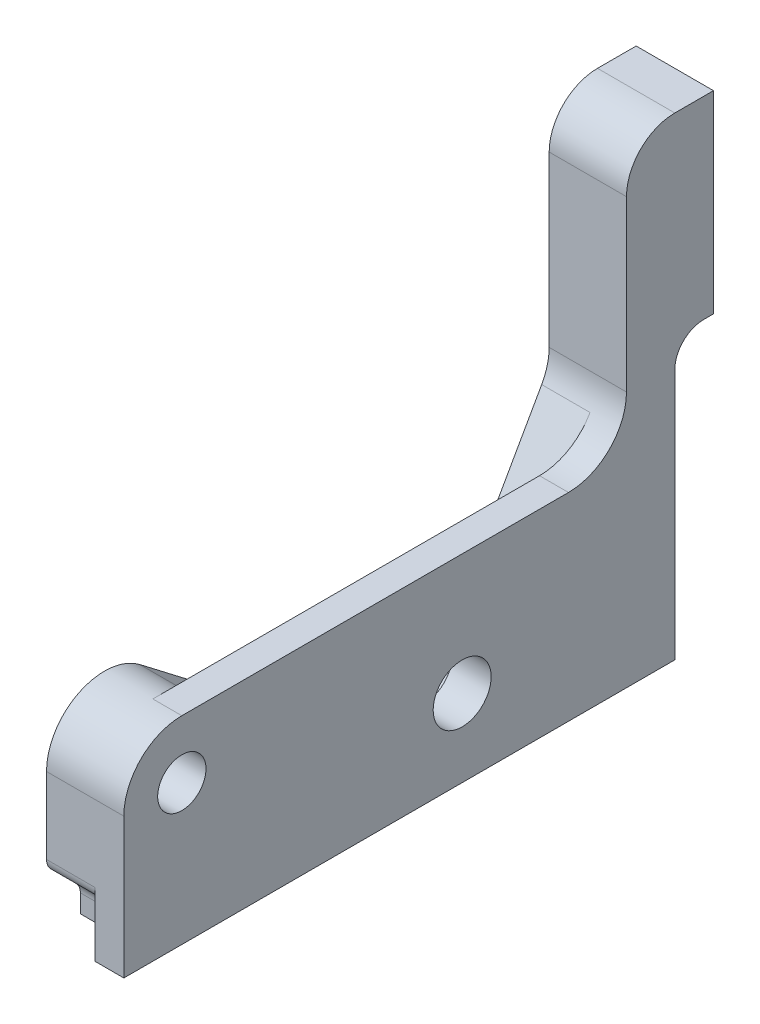
ISO-10303-21;
HEADER;
FILE_DESCRIPTION(('STEP AP214'),'2;1');
FILE_NAME('part.step','',(''),(''),'','','');
FILE_SCHEMA(('AUTOMOTIVE_DESIGN { 1 0 10303 214 1 1 1 1 }'));
ENDSEC;
DATA;
#1=APPLICATION_CONTEXT('core data for automotive mechanical design processes');
#2=APPLICATION_PROTOCOL_DEFINITION('international standard','automotive_design',2000,#1);
#3=PRODUCT_CONTEXT('',#1,'mechanical');
#4=PRODUCT('Part','Part','',(#3));
#5=PRODUCT_RELATED_PRODUCT_CATEGORY('part','',(#4));
#6=PRODUCT_DEFINITION_FORMATION('','',#4);
#7=PRODUCT_DEFINITION_CONTEXT('part definition',#1,'design');
#8=PRODUCT_DEFINITION('design','',#6,#7);
#9=PRODUCT_DEFINITION_SHAPE('','',#8);
#10=(LENGTH_UNIT() NAMED_UNIT(*) SI_UNIT(.MILLI.,.METRE.));
#11=(NAMED_UNIT(*) PLANE_ANGLE_UNIT() SI_UNIT($,.RADIAN.));
#12=(NAMED_UNIT(*) SI_UNIT($,.STERADIAN.) SOLID_ANGLE_UNIT());
#13=UNCERTAINTY_MEASURE_WITH_UNIT(LENGTH_MEASURE(1.E-05),#10,'distance_accuracy_value','');
#14=(GEOMETRIC_REPRESENTATION_CONTEXT(3) GLOBAL_UNCERTAINTY_ASSIGNED_CONTEXT((#13)) GLOBAL_UNIT_ASSIGNED_CONTEXT((#10,
#11,#12)) REPRESENTATION_CONTEXT('',''));
#15=CARTESIAN_POINT('',(0.,0.,0.));
#16=DIRECTION('',(0.,0.,1.));
#17=DIRECTION('',(1.,0.,0.));
#18=AXIS2_PLACEMENT_3D('',#15,#16,#17);
#19=CARTESIAN_POINT('',(5.,26.5,-46.));
#20=DIRECTION('',(-1.,0.,0.));
#21=DIRECTION('',(0.,0.,1.));
#22=AXIS2_PLACEMENT_3D('',#19,#20,#21);
#23=PLANE('',#22);
#24=DIRECTION('',(0.,-0.871176564792176,0.490969849335888));
#25=VECTOR('',#24,1.);
#26=CARTESIAN_POINT('',(5.,23.5541809039847,-51.2270593887531));
#27=LINE('',#26,#25);
#28=CARTESIAN_POINT('',(5.,23.5541809039847,-51.2270593887531));
#29=VERTEX_POINT('',#28);
#30=CARTESIAN_POINT('',(5.,8.42696400027555,-42.7017986043825));
#31=VERTEX_POINT('',#30);
#32=EDGE_CURVE('E276',#29,#31,#27,.T.);
#33=ORIENTED_EDGE('',*,*,#32,.T.);
#34=CARTESIAN_POINT('',(5.,9.16341877427939,-41.3950337571943));
#35=DIRECTION('',(1.,0.,0.));
#36=DIRECTION('',(0.,0.,-1.));
#37=AXIS2_PLACEMENT_3D('',#34,#35,#36);
#38=CIRCLE('',#37,1.5);
#39=CARTESIAN_POINT('',(5.,8.89493751867645,-39.9192567363033));
#40=VERTEX_POINT('',#39);
#41=EDGE_CURVE('E228',#40,#31,#38,.T.);
#42=ORIENTED_EDGE('',*,*,#41,.F.);
#43=CARTESIAN_POINT('',(5.,8.,-35.));
#44=DIRECTION('',(-1.,0.,0.));
#45=DIRECTION('',(0.,0.,-1.));
#46=AXIS2_PLACEMENT_3D('',#43,#44,#45);
#47=CIRCLE('',#46,5.);
#48=CARTESIAN_POINT('',(5.,6.89403672609652,-30.1238493422807));
#49=VERTEX_POINT('',#48);
#50=EDGE_CURVE('E222',#49,#40,#47,.T.);
#51=ORIENTED_EDGE('',*,*,#50,.F.);
#52=CARTESIAN_POINT('',(5.,6.56224774392547,-28.6610041449649));
#53=DIRECTION('',(1.,0.,0.));
#54=DIRECTION('',(0.,0.,1.));
#55=AXIS2_PLACEMENT_3D('',#52,#53,#54);
#56=CIRCLE('',#55,1.5);
#57=CARTESIAN_POINT('',(5.,5.37230969427247,-27.7477421683185));
#58=VERTEX_POINT('',#57);
#59=EDGE_CURVE('E251',#58,#49,#56,.T.);
#60=ORIENTED_EDGE('',*,*,#59,.F.);
#61=DIRECTION('',(0.,0.608841317764241,0.793292033101999));
#62=VECTOR('',#61,1.);
#63=CARTESIAN_POINT('',(5.,2.84360178483701,-31.0425314345324));
#64=LINE('',#63,#62);
#65=CARTESIAN_POINT('',(5.,19.259752198612,-9.65304790658545));
#66=VERTEX_POINT('',#65);
#67=EDGE_CURVE('E278',#58,#66,#64,.T.);
#68=ORIENTED_EDGE('',*,*,#67,.T.);
#69=CARTESIAN_POINT('',(5.,14.5,-6.));
#70=DIRECTION('',(1.,0.,0.));
#71=DIRECTION('',(0.,0.,-1.));
#72=AXIS2_PLACEMENT_3D('',#69,#70,#71);
#73=CIRCLE('',#72,6.);
#74=CARTESIAN_POINT('',(5.,20.5,-6.));
#75=VERTEX_POINT('',#74);
#76=EDGE_CURVE('E281',#66,#75,#73,.T.);
#77=ORIENTED_EDGE('',*,*,#76,.T.);
#78=DIRECTION('',(0.,0.,-1.));
#79=VECTOR('',#78,1.);
#80=CARTESIAN_POINT('',(5.,20.5,-6.));
#81=LINE('',#80,#79);
#82=CARTESIAN_POINT('',(5.,20.5,-46.));
#83=VERTEX_POINT('',#82);
#84=EDGE_CURVE('E418',#75,#83,#81,.T.);
#85=ORIENTED_EDGE('',*,*,#84,.T.);
#86=CARTESIAN_POINT('',(5.,26.5,-46.));
#87=DIRECTION('',(-1.,0.,0.));
#88=DIRECTION('',(0.,0.,1.));
#89=AXIS2_PLACEMENT_3D('',#86,#87,#88);
#90=CIRCLE('',#89,6.);
#91=EDGE_CURVE('E293',#83,#29,#90,.F.);
#92=ORIENTED_EDGE('',*,*,#91,.T.);
#93=EDGE_LOOP('',(#33,#42,#51,#60,#68,#77,#85,#92));
#94=FACE_BOUND('',#93,.T.);
#95=ADVANCED_FACE('F32',(#94),#23,.T.);
#96=CARTESIAN_POINT('',(5.,2.84360178483701,-31.0425314345324));
#97=DIRECTION('',(0.,-0.793292033101999,0.608841317764241));
#98=DIRECTION('',(0.,-0.608841317764241,-0.793292033101999));
#99=AXIS2_PLACEMENT_3D('',#96,#97,#98);
#100=PLANE('',#99);
#101=DIRECTION('',(0.,0.608841317764241,0.793292033101999));
#102=VECTOR('',#101,1.);
#103=CARTESIAN_POINT('',(4.,2.84360178483701,-31.0425314345324));
#104=LINE('',#103,#102);
#105=CARTESIAN_POINT('',(4.,2.84360178483701,-31.0425314345324));
#106=VERTEX_POINT('',#105);
#107=CARTESIAN_POINT('',(4.,5.37230969427247,-27.7477421683185));
#108=VERTEX_POINT('',#107);
#109=EDGE_CURVE('E241',#106,#108,#104,.T.);
#110=ORIENTED_EDGE('',*,*,#109,.F.);
#111=DIRECTION('',(-1.,0.,0.));
#112=VECTOR('',#111,1.);
#113=CARTESIAN_POINT('',(5.,2.84360178483701,-31.0425314345324));
#114=LINE('',#113,#112);
#115=CARTESIAN_POINT('',(0.,2.84360178483701,-31.0425314345324));
#116=VERTEX_POINT('',#115);
#117=EDGE_CURVE('E294',#106,#116,#114,.T.);
#118=ORIENTED_EDGE('',*,*,#117,.T.);
#119=DIRECTION('',(0.,0.608841317764241,0.793292033101999));
#120=VECTOR('',#119,1.);
#121=CARTESIAN_POINT('',(0.,2.84360178483701,-31.0425314345324));
#122=LINE('',#121,#120);
#123=CARTESIAN_POINT('',(0.,19.259752198612,-9.65304790658545));
#124=VERTEX_POINT('',#123);
#125=EDGE_CURVE('E279',#116,#124,#122,.T.);
#126=ORIENTED_EDGE('',*,*,#125,.T.);
#127=DIRECTION('',(-1.,0.,0.));
#128=VECTOR('',#127,1.);
#129=CARTESIAN_POINT('',(5.,19.259752198612,-9.65304790658545));
#130=LINE('',#129,#128);
#131=EDGE_CURVE('E290',#66,#124,#130,.T.);
#132=ORIENTED_EDGE('',*,*,#131,.F.);
#133=ORIENTED_EDGE('',*,*,#67,.F.);
#134=DIRECTION('',(1.,0.,0.));
#135=VECTOR('',#134,1.);
#136=CARTESIAN_POINT('',(4.,5.37230969427247,-27.7477421683185));
#137=LINE('',#136,#135);
#138=EDGE_CURVE('E233',#108,#58,#137,.T.);
#139=ORIENTED_EDGE('',*,*,#138,.F.);
#140=EDGE_LOOP('',(#110,#118,#126,#132,#133,#139));
#141=FACE_BOUND('',#140,.T.);
#142=ADVANCED_FACE('F468',(#141),#100,.F.);
#143=CARTESIAN_POINT('',(5.,8.,-35.));
#144=DIRECTION('',(-1.,0.,0.));
#145=DIRECTION('',(0.,0.,1.));
#146=AXIS2_PLACEMENT_3D('',#143,#144,#145);
#147=CYLINDRICAL_SURFACE('',#146,6.5);
#148=CARTESIAN_POINT('',(4.,8.00000000000004,-35.));
#149=DIRECTION('',(-1.,0.,0.));
#150=DIRECTION('',(0.,0.,1.));
#151=AXIS2_PLACEMENT_3D('',#148,#149,#150);
#152=CIRCLE('',#151,6.50000000000003);
#153=CARTESIAN_POINT('',(4.,4.80869597931673,-40.6626476711491));
#154=VERTEX_POINT('',#153);
#155=EDGE_CURVE('E239',#154,#106,#152,.T.);
#156=ORIENTED_EDGE('',*,*,#155,.F.);
#157=DIRECTION('',(-1.,0.,0.));
#158=VECTOR('',#157,1.);
#159=CARTESIAN_POINT('',(5.,4.80869597931673,-40.6626476711491));
#160=LINE('',#159,#158);
#161=CARTESIAN_POINT('',(0.,4.80869597931673,-40.6626476711491));
#162=VERTEX_POINT('',#161);
#163=EDGE_CURVE('E238',#154,#162,#160,.T.);
#164=ORIENTED_EDGE('',*,*,#163,.T.);
#165=CARTESIAN_POINT('',(0.,8.,-35.));
#166=DIRECTION('',(-1.,0.,0.));
#167=DIRECTION('',(0.,0.,1.));
#168=AXIS2_PLACEMENT_3D('',#165,#166,#167);
#169=CIRCLE('',#168,6.5);
#170=EDGE_CURVE('E285',#162,#116,#169,.T.);
#171=ORIENTED_EDGE('',*,*,#170,.T.);
#172=ORIENTED_EDGE('',*,*,#117,.F.);
#173=EDGE_LOOP('',(#156,#164,#171,#172));
#174=FACE_BOUND('',#173,.T.);
#175=ADVANCED_FACE('F474',(#174),#147,.F.);
#176=CARTESIAN_POINT('',(5.,23.5541809039847,-51.2270593887531));
#177=DIRECTION('',(0.,-0.490969849335888,-0.871176564792175));
#178=DIRECTION('',(0.,0.871176564792176,-0.490969849335888));
#179=AXIS2_PLACEMENT_3D('',#176,#177,#178);
#180=PLANE('',#179);
#181=DIRECTION('',(0.,-0.871176564792175,0.490969849335888));
#182=VECTOR('',#181,1.);
#183=CARTESIAN_POINT('',(4.,8.42696400027556,-42.7017986043825));
#184=LINE('',#183,#182);
#185=CARTESIAN_POINT('',(4.,8.42696400027556,-42.7017986043825));
#186=VERTEX_POINT('',#185);
#187=EDGE_CURVE('E215',#186,#154,#184,.T.);
#188=ORIENTED_EDGE('',*,*,#187,.F.);
#189=DIRECTION('',(1.,0.,0.));
#190=VECTOR('',#189,1.);
#191=CARTESIAN_POINT('',(4.,8.42696400027556,-42.7017986043825));
#192=LINE('',#191,#190);
#193=EDGE_CURVE('E225',#186,#31,#192,.T.);
#194=ORIENTED_EDGE('',*,*,#193,.T.);
#195=ORIENTED_EDGE('',*,*,#32,.F.);
#196=DIRECTION('',(-1.,0.,0.));
#197=VECTOR('',#196,1.);
#198=CARTESIAN_POINT('',(5.,23.5541809039847,-51.2270593887531));
#199=LINE('',#198,#197);
#200=CARTESIAN_POINT('',(0.,23.5541809039847,-51.2270593887531));
#201=VERTEX_POINT('',#200);
#202=EDGE_CURVE('E283',#29,#201,#199,.T.);
#203=ORIENTED_EDGE('',*,*,#202,.T.);
#204=DIRECTION('',(0.,-0.871176564792176,0.490969849335888));
#205=VECTOR('',#204,1.);
#206=CARTESIAN_POINT('',(0.,23.5541809039847,-51.2270593887531));
#207=LINE('',#206,#205);
#208=EDGE_CURVE('E275',#201,#162,#207,.T.);
#209=ORIENTED_EDGE('',*,*,#208,.T.);
#210=ORIENTED_EDGE('',*,*,#163,.F.);
#211=EDGE_LOOP('',(#188,#194,#195,#203,#209,#210));
#212=FACE_BOUND('',#211,.T.);
#213=ADVANCED_FACE('F236',(#212),#180,.F.);
#214=CARTESIAN_POINT('',(8.,8.,-35.));
#215=DIRECTION('',(-1.,0.,0.));
#216=DIRECTION('',(0.,0.,1.));
#217=AXIS2_PLACEMENT_3D('',#214,#215,#216);
#218=CYLINDRICAL_SURFACE('',#217,3.);
#219=CARTESIAN_POINT('',(8.,8.,-35.));
#220=DIRECTION('',(1.,0.,0.));
#221=DIRECTION('',(0.,0.,-1.));
#222=AXIS2_PLACEMENT_3D('',#219,#220,#221);
#223=CIRCLE('',#222,3.);
#224=CARTESIAN_POINT('',(8.,8.,-38.));
#225=VERTEX_POINT('',#224);
#226=EDGE_CURVE('E361',#225,#225,#223,.T.);
#227=ORIENTED_EDGE('',*,*,#226,.T.);
#228=EDGE_LOOP('',(#227));
#229=FACE_BOUND('',#228,.T.);
#230=CARTESIAN_POINT('',(4.,8.,-35.));
#231=DIRECTION('',(-1.,0.,0.));
#232=DIRECTION('',(0.,0.,1.));
#233=AXIS2_PLACEMENT_3D('',#230,#231,#232);
#234=CIRCLE('',#233,3.);
#235=CARTESIAN_POINT('',(4.,8.,-32.));
#236=VERTEX_POINT('',#235);
#237=EDGE_CURVE('E252',#236,#236,#234,.T.);
#238=ORIENTED_EDGE('',*,*,#237,.T.);
#239=EDGE_LOOP('',(#238));
#240=FACE_BOUND('',#239,.T.);
#241=ADVANCED_FACE('F485',(#229,#240),#218,.F.);
#242=CARTESIAN_POINT('',(-0.000999999999999265,26.5,-46.));
#243=DIRECTION('',(1.,0.,0.));
#244=DIRECTION('',(0.,0.,-1.));
#245=AXIS2_PLACEMENT_3D('',#242,#243,#244);
#246=CYLINDRICAL_SURFACE('',#245,6.);
#247=ORIENTED_EDGE('',*,*,#91,.F.);
#248=DIRECTION('',(1.,0.,0.));
#249=VECTOR('',#248,1.);
#250=CARTESIAN_POINT('',(-0.000999999999999265,20.5,-46.));
#251=LINE('',#250,#249);
#252=CARTESIAN_POINT('',(8.,20.5,-46.));
#253=VERTEX_POINT('',#252);
#254=EDGE_CURVE('E364',#83,#253,#251,.T.);
#255=ORIENTED_EDGE('',*,*,#254,.T.);
#256=CARTESIAN_POINT('',(8.,26.5,-46.));
#257=DIRECTION('',(1.,0.,0.));
#258=DIRECTION('',(0.,0.,-1.));
#259=AXIS2_PLACEMENT_3D('',#256,#257,#258);
#260=CIRCLE('',#259,6.);
#261=CARTESIAN_POINT('',(8.,26.5,-52.));
#262=VERTEX_POINT('',#261);
#263=EDGE_CURVE('E352',#253,#262,#260,.T.);
#264=ORIENTED_EDGE('',*,*,#263,.T.);
#265=DIRECTION('',(1.,0.,0.));
#266=VECTOR('',#265,1.);
#267=CARTESIAN_POINT('',(-0.000999999999999265,26.5,-52.));
#268=LINE('',#267,#266);
#269=CARTESIAN_POINT('',(0.,26.5,-52.));
#270=VERTEX_POINT('',#269);
#271=EDGE_CURVE('E362',#270,#262,#268,.T.);
#272=ORIENTED_EDGE('',*,*,#271,.F.);
#273=CARTESIAN_POINT('',(0.,26.5,-46.));
#274=DIRECTION('',(-1.,0.,0.));
#275=DIRECTION('',(0.,0.,1.));
#276=AXIS2_PLACEMENT_3D('',#273,#274,#275);
#277=CIRCLE('',#276,6.);
#278=EDGE_CURVE('E339',#201,#270,#277,.F.);
#279=ORIENTED_EDGE('',*,*,#278,.F.);
#280=ORIENTED_EDGE('',*,*,#202,.F.);
#281=EDGE_LOOP('',(#247,#255,#264,#272,#279,#280));
#282=FACE_BOUND('',#281,.T.);
#283=ADVANCED_FACE('F533',(#282),#246,.F.);
#284=CARTESIAN_POINT('',(-0.000999999999999265,20.5,-6.));
#285=DIRECTION('',(0.,-1.,0.));
#286=DIRECTION('',(0.,0.,-1.));
#287=AXIS2_PLACEMENT_3D('',#284,#285,#286);
#288=PLANE('',#287);
#289=ORIENTED_EDGE('',*,*,#84,.F.);
#290=DIRECTION('',(1.,0.,0.));
#291=VECTOR('',#290,1.);
#292=CARTESIAN_POINT('',(-0.000999999999999265,20.5,-6.));
#293=LINE('',#292,#291);
#294=CARTESIAN_POINT('',(8.,20.5,-6.));
#295=VERTEX_POINT('',#294);
#296=EDGE_CURVE('E358',#75,#295,#293,.T.);
#297=ORIENTED_EDGE('',*,*,#296,.T.);
#298=DIRECTION('',(0.,0.,-1.));
#299=VECTOR('',#298,1.);
#300=CARTESIAN_POINT('',(8.,20.5,-6.));
#301=LINE('',#300,#299);
#302=EDGE_CURVE('E349',#295,#253,#301,.T.);
#303=ORIENTED_EDGE('',*,*,#302,.T.);
#304=ORIENTED_EDGE('',*,*,#254,.F.);
#305=EDGE_LOOP('',(#289,#297,#303,#304));
#306=FACE_BOUND('',#305,.T.);
#307=ADVANCED_FACE('F536',(#306),#288,.F.);
#308=CARTESIAN_POINT('',(8.,49.,0.));
#309=DIRECTION('',(-1.,0.,0.));
#310=DIRECTION('',(0.,0.,1.));
#311=AXIS2_PLACEMENT_3D('',#308,#309,#310);
#312=PLANE('',#311);
#313=CARTESIAN_POINT('',(8.,14.5,-6.));
#314=DIRECTION('',(1.,0.,0.));
#315=DIRECTION('',(0.,0.,-1.));
#316=AXIS2_PLACEMENT_3D('',#313,#314,#315);
#317=CIRCLE('',#316,2.5);
#318=CARTESIAN_POINT('',(8.,14.5,-8.5));
#319=VERTEX_POINT('',#318);
#320=EDGE_CURVE('E370',#319,#319,#317,.T.);
#321=ORIENTED_EDGE('',*,*,#320,.F.);
#322=EDGE_LOOP('',(#321));
#323=FACE_BOUND('',#322,.T.);
#324=DIRECTION('',(0.,0.,1.));
#325=VECTOR('',#324,1.);
#326=CARTESIAN_POINT('',(8.,49.,0.));
#327=LINE('',#326,#325);
#328=CARTESIAN_POINT('',(8.,49.,-61.));
#329=VERTEX_POINT('',#328);
#330=CARTESIAN_POINT('',(8.,49.,-57.));
#331=VERTEX_POINT('',#330);
#332=EDGE_CURVE('E384',#329,#331,#327,.T.);
#333=ORIENTED_EDGE('',*,*,#332,.T.);
#334=CARTESIAN_POINT('',(8.,44.,-57.));
#335=DIRECTION('',(-1.,0.,0.));
#336=DIRECTION('',(0.,0.,1.));
#337=AXIS2_PLACEMENT_3D('',#334,#335,#336);
#338=CIRCLE('',#337,5.);
#339=CARTESIAN_POINT('',(8.,44.,-52.));
#340=VERTEX_POINT('',#339);
#341=EDGE_CURVE('E407',#331,#340,#338,.F.);
#342=ORIENTED_EDGE('',*,*,#341,.T.);
#343=DIRECTION('',(0.,1.,0.));
#344=VECTOR('',#343,1.);
#345=CARTESIAN_POINT('',(8.,50.,-52.));
#346=LINE('',#345,#344);
#347=EDGE_CURVE('E355',#262,#340,#346,.T.);
#348=ORIENTED_EDGE('',*,*,#347,.F.);
#349=ORIENTED_EDGE('',*,*,#263,.F.);
#350=ORIENTED_EDGE('',*,*,#302,.F.);
#351=CARTESIAN_POINT('',(8.,14.5,-6.));
#352=DIRECTION('',(-1.,0.,0.));
#353=DIRECTION('',(0.,0.,1.));
#354=AXIS2_PLACEMENT_3D('',#351,#352,#353);
#355=CIRCLE('',#354,6.);
#356=CARTESIAN_POINT('',(8.,14.5,0.));
#357=VERTEX_POINT('',#356);
#358=EDGE_CURVE('E346',#357,#295,#355,.T.);
#359=ORIENTED_EDGE('',*,*,#358,.F.);
#360=DIRECTION('',(0.,-1.,0.));
#361=VECTOR('',#360,1.);
#362=CARTESIAN_POINT('',(8.,0.,0.));
#363=LINE('',#362,#361);
#364=CARTESIAN_POINT('',(8.,0.,0.));
#365=VERTEX_POINT('',#364);
#366=EDGE_CURVE('E376',#357,#365,#363,.T.);
#367=ORIENTED_EDGE('',*,*,#366,.T.);
#368=DIRECTION('',(0.,0.,-1.));
#369=VECTOR('',#368,1.);
#370=CARTESIAN_POINT('',(8.,0.,0.));
#371=LINE('',#370,#369);
#372=CARTESIAN_POINT('',(8.,0.,-57.));
#373=VERTEX_POINT('',#372);
#374=EDGE_CURVE('E378',#365,#373,#371,.T.);
#375=ORIENTED_EDGE('',*,*,#374,.T.);
#376=DIRECTION('',(0.,-1.,0.));
#377=VECTOR('',#376,1.);
#378=CARTESIAN_POINT('',(8.,0.,-57.));
#379=LINE('',#378,#377);
#380=CARTESIAN_POINT('',(8.,26.,-57.));
#381=VERTEX_POINT('',#380);
#382=EDGE_CURVE('E329',#381,#373,#379,.T.);
#383=ORIENTED_EDGE('',*,*,#382,.F.);
#384=CARTESIAN_POINT('',(8.,26.,-60.));
#385=DIRECTION('',(-1.,0.,0.));
#386=DIRECTION('',(0.,0.,1.));
#387=AXIS2_PLACEMENT_3D('',#384,#385,#386);
#388=CIRCLE('',#387,3.);
#389=CARTESIAN_POINT('',(8.,29.,-60.));
#390=VERTEX_POINT('',#389);
#391=EDGE_CURVE('E414',#381,#390,#388,.T.);
#392=ORIENTED_EDGE('',*,*,#391,.T.);
#393=DIRECTION('',(0.,0.,1.));
#394=VECTOR('',#393,1.);
#395=CARTESIAN_POINT('',(8.,29.,-61.));
#396=LINE('',#395,#394);
#397=CARTESIAN_POINT('',(8.,29.,-61.));
#398=VERTEX_POINT('',#397);
#399=EDGE_CURVE('E326',#398,#390,#396,.T.);
#400=ORIENTED_EDGE('',*,*,#399,.F.);
#401=DIRECTION('',(0.,1.,0.));
#402=VECTOR('',#401,1.);
#403=CARTESIAN_POINT('',(8.,0.,-61.));
#404=LINE('',#403,#402);
#405=EDGE_CURVE('E382',#398,#329,#404,.T.);
#406=ORIENTED_EDGE('',*,*,#405,.T.);
#407=EDGE_LOOP('',(#333,#342,#348,#349,#350,#359,#367,#375,#383,#392,#400,#406));
#408=FACE_BOUND('',#407,.T.);
#409=ORIENTED_EDGE('',*,*,#226,.F.);
#410=EDGE_LOOP('',(#409));
#411=FACE_BOUND('',#410,.T.);
#412=ADVANCED_FACE('F540',(#323,#408,#411),#312,.F.);
#413=CARTESIAN_POINT('',(0.,49.,0.));
#414=DIRECTION('',(-1.,0.,0.));
#415=DIRECTION('',(0.,0.,1.));
#416=AXIS2_PLACEMENT_3D('',#413,#414,#415);
#417=PLANE('',#416);
#418=DIRECTION('',(0.,-0.707106781186551,-0.707106781186544));
#419=VECTOR('',#418,1.);
#420=CARTESIAN_POINT('',(0.,6.,0.));
#421=LINE('',#420,#419);
#422=CARTESIAN_POINT('',(0.,5.56066017177982,-0.439339828220173));
#423=VERTEX_POINT('',#422);
#424=CARTESIAN_POINT('',(0.,2.93933982822014,-3.06066017177983));
#425=VERTEX_POINT('',#424);
#426=EDGE_CURVE('E232',#423,#425,#421,.T.);
#427=ORIENTED_EDGE('',*,*,#426,.F.);
#428=CARTESIAN_POINT('',(0.,6.62132034355964,-1.5));
#429=DIRECTION('',(-1.,0.,0.));
#430=DIRECTION('',(0.,0.,1.));
#431=AXIS2_PLACEMENT_3D('',#428,#429,#430);
#432=CIRCLE('',#431,1.5);
#433=CARTESIAN_POINT('',(0.,6.62132034355964,0.));
#434=VERTEX_POINT('',#433);
#435=EDGE_CURVE('E54',#423,#434,#432,.T.);
#436=ORIENTED_EDGE('',*,*,#435,.T.);
#437=DIRECTION('',(0.,-1.,0.));
#438=VECTOR('',#437,1.);
#439=CARTESIAN_POINT('',(0.,0.,0.));
#440=LINE('',#439,#438);
#441=CARTESIAN_POINT('',(0.,14.5,0.));
#442=VERTEX_POINT('',#441);
#443=EDGE_CURVE('E373',#442,#434,#440,.T.);
#444=ORIENTED_EDGE('',*,*,#443,.F.);
#445=CARTESIAN_POINT('',(0.,14.5,-6.));
#446=DIRECTION('',(-1.,0.,0.));
#447=DIRECTION('',(0.,0.,1.));
#448=AXIS2_PLACEMENT_3D('',#445,#446,#447);
#449=CIRCLE('',#448,6.);
#450=EDGE_CURVE('E344',#442,#124,#449,.T.);
#451=ORIENTED_EDGE('',*,*,#450,.T.);
#452=ORIENTED_EDGE('',*,*,#125,.F.);
#453=ORIENTED_EDGE('',*,*,#170,.F.);
#454=ORIENTED_EDGE('',*,*,#208,.F.);
#455=ORIENTED_EDGE('',*,*,#278,.T.);
#456=DIRECTION('',(0.,1.,0.));
#457=VECTOR('',#456,1.);
#458=CARTESIAN_POINT('',(0.,50.,-52.));
#459=LINE('',#458,#457);
#460=CARTESIAN_POINT('',(0.,44.,-52.));
#461=VERTEX_POINT('',#460);
#462=EDGE_CURVE('E341',#270,#461,#459,.T.);
#463=ORIENTED_EDGE('',*,*,#462,.T.);
#464=CARTESIAN_POINT('',(0.,44.,-57.));
#465=DIRECTION('',(-1.,0.,0.));
#466=DIRECTION('',(0.,0.,1.));
#467=AXIS2_PLACEMENT_3D('',#464,#465,#466);
#468=CIRCLE('',#467,5.);
#469=CARTESIAN_POINT('',(0.,49.,-57.));
#470=VERTEX_POINT('',#469);
#471=EDGE_CURVE('E403',#461,#470,#468,.T.);
#472=ORIENTED_EDGE('',*,*,#471,.T.);
#473=DIRECTION('',(0.,0.,1.));
#474=VECTOR('',#473,1.);
#475=CARTESIAN_POINT('',(0.,49.,0.));
#476=LINE('',#475,#474);
#477=CARTESIAN_POINT('',(0.,49.,-61.));
#478=VERTEX_POINT('',#477);
#479=EDGE_CURVE('E379',#478,#470,#476,.T.);
#480=ORIENTED_EDGE('',*,*,#479,.F.);
#481=DIRECTION('',(0.,1.,0.));
#482=VECTOR('',#481,1.);
#483=CARTESIAN_POINT('',(0.,0.,-61.));
#484=LINE('',#483,#482);
#485=CARTESIAN_POINT('',(0.,29.,-61.));
#486=VERTEX_POINT('',#485);
#487=EDGE_CURVE('E391',#486,#478,#484,.T.);
#488=ORIENTED_EDGE('',*,*,#487,.F.);
#489=DIRECTION('',(0.,0.,1.));
#490=VECTOR('',#489,1.);
#491=CARTESIAN_POINT('',(0.,29.,-61.));
#492=LINE('',#491,#490);
#493=CARTESIAN_POINT('',(0.,29.,-60.));
#494=VERTEX_POINT('',#493);
#495=EDGE_CURVE('E335',#486,#494,#492,.T.);
#496=ORIENTED_EDGE('',*,*,#495,.T.);
#497=CARTESIAN_POINT('',(0.,26.,-60.));
#498=DIRECTION('',(-1.,0.,0.));
#499=DIRECTION('',(0.,0.,1.));
#500=AXIS2_PLACEMENT_3D('',#497,#498,#499);
#501=CIRCLE('',#500,3.);
#502=CARTESIAN_POINT('',(0.,26.,-57.));
#503=VERTEX_POINT('',#502);
#504=EDGE_CURVE('E416',#494,#503,#501,.F.);
#505=ORIENTED_EDGE('',*,*,#504,.T.);
#506=DIRECTION('',(0.,-1.,0.));
#507=VECTOR('',#506,1.);
#508=CARTESIAN_POINT('',(0.,0.,-57.));
#509=LINE('',#508,#507);
#510=CARTESIAN_POINT('',(0.,0.,-57.));
#511=VERTEX_POINT('',#510);
#512=EDGE_CURVE('E323',#503,#511,#509,.T.);
#513=ORIENTED_EDGE('',*,*,#512,.T.);
#514=DIRECTION('',(0.,0.,-1.));
#515=VECTOR('',#514,1.);
#516=CARTESIAN_POINT('',(0.,0.,0.));
#517=LINE('',#516,#515);
#518=CARTESIAN_POINT('',(0.,0.,-3.5));
#519=VERTEX_POINT('',#518);
#520=EDGE_CURVE('E389',#519,#511,#517,.T.);
#521=ORIENTED_EDGE('',*,*,#520,.F.);
#522=DIRECTION('',(0.,-1.,0.));
#523=VECTOR('',#522,1.);
#524=CARTESIAN_POINT('',(0.,2.49999999999996,-3.5));
#525=LINE('',#524,#523);
#526=CARTESIAN_POINT('',(0.,1.87867965644032,-3.5));
#527=VERTEX_POINT('',#526);
#528=EDGE_CURVE('E262',#527,#519,#525,.T.);
#529=ORIENTED_EDGE('',*,*,#528,.F.);
#530=CARTESIAN_POINT('',(0.,1.87867965644032,-2.));
#531=DIRECTION('',(-1.,0.,0.));
#532=DIRECTION('',(0.,0.,1.));
#533=AXIS2_PLACEMENT_3D('',#530,#531,#532);
#534=CIRCLE('',#533,1.5);
#535=EDGE_CURVE('E40',#527,#425,#534,.F.);
#536=ORIENTED_EDGE('',*,*,#535,.T.);
#537=EDGE_LOOP('',(#427,#436,#444,#451,#452,#453,#454,#455,#463,#472,#480,#488,#496,#505,#513,
#521,#529,#536));
#538=FACE_BOUND('',#537,.T.);
#539=CARTESIAN_POINT('',(0.,14.5,-6.));
#540=DIRECTION('',(1.,0.,0.));
#541=DIRECTION('',(0.,0.,-1.));
#542=AXIS2_PLACEMENT_3D('',#539,#540,#541);
#543=CIRCLE('',#542,2.5);
#544=CARTESIAN_POINT('',(0.,14.5,-8.5));
#545=VERTEX_POINT('',#544);
#546=EDGE_CURVE('E369',#545,#545,#543,.T.);
#547=ORIENTED_EDGE('',*,*,#546,.T.);
#548=EDGE_LOOP('',(#547));
#549=FACE_BOUND('',#548,.T.);
#550=ADVANCED_FACE('F433',(#538,#549),#417,.T.);
#551=CARTESIAN_POINT('',(8.,0.,0.));
#552=DIRECTION('',(0.,0.,-1.));
#553=DIRECTION('',(-1.,0.,0.));
#554=AXIS2_PLACEMENT_3D('',#551,#552,#553);
#555=PLANE('',#554);
#556=ORIENTED_EDGE('',*,*,#443,.T.);
#557=DIRECTION('',(-1.,0.,0.));
#558=VECTOR('',#557,1.);
#559=CARTESIAN_POINT('',(8.,6.62132034355964,0.));
#560=LINE('',#559,#558);
#561=CARTESIAN_POINT('',(5.,6.62132034355964,0.));
#562=VERTEX_POINT('',#561);
#563=EDGE_CURVE('E431',#434,#562,#560,.F.);
#564=ORIENTED_EDGE('',*,*,#563,.T.);
#565=DIRECTION('',(0.,1.,0.));
#566=VECTOR('',#565,1.);
#567=CARTESIAN_POINT('',(5.,0.,0.));
#568=LINE('',#567,#566);
#569=CARTESIAN_POINT('',(5.,0.,0.));
#570=VERTEX_POINT('',#569);
#571=EDGE_CURVE('E46',#570,#562,#568,.T.);
#572=ORIENTED_EDGE('',*,*,#571,.F.);
#573=DIRECTION('',(-1.,0.,0.));
#574=VECTOR('',#573,1.);
#575=CARTESIAN_POINT('',(8.,0.,0.));
#576=LINE('',#575,#574);
#577=EDGE_CURVE('E397',#365,#570,#576,.T.);
#578=ORIENTED_EDGE('',*,*,#577,.F.);
#579=ORIENTED_EDGE('',*,*,#366,.F.);
#580=DIRECTION('',(1.,0.,0.));
#581=VECTOR('',#580,1.);
#582=CARTESIAN_POINT('',(-0.000999999999999265,14.5,0.));
#583=LINE('',#582,#581);
#584=EDGE_CURVE('E359',#442,#357,#583,.T.);
#585=ORIENTED_EDGE('',*,*,#584,.F.);
#586=EDGE_LOOP('',(#556,#564,#572,#578,#579,#585));
#587=FACE_BOUND('',#586,.T.);
#588=ADVANCED_FACE('F456',(#587),#555,.F.);
#589=CARTESIAN_POINT('',(8.,0.,0.));
#590=DIRECTION('',(0.,1.,0.));
#591=DIRECTION('',(0.,0.,1.));
#592=AXIS2_PLACEMENT_3D('',#589,#590,#591);
#593=PLANE('',#592);
#594=CARTESIAN_POINT('',(4.,0.,-48.));
#595=DIRECTION('',(0.,-1.,0.));
#596=DIRECTION('',(0.,0.,-1.));
#597=AXIS2_PLACEMENT_3D('',#594,#595,#596);
#598=CIRCLE('',#597,1.24999999999999);
#599=CARTESIAN_POINT('',(4.,0.,-49.25));
#600=VERTEX_POINT('',#599);
#601=EDGE_CURVE('E311',#600,#600,#598,.T.);
#602=ORIENTED_EDGE('',*,*,#601,.F.);
#603=EDGE_LOOP('',(#602));
#604=FACE_BOUND('',#603,.T.);
#605=CARTESIAN_POINT('',(4.,0.,-12.));
#606=DIRECTION('',(0.,-1.,0.));
#607=DIRECTION('',(0.,0.,-1.));
#608=AXIS2_PLACEMENT_3D('',#605,#606,#607);
#609=CIRCLE('',#608,1.24999999999999);
#610=CARTESIAN_POINT('',(4.,0.,-13.25));
#611=VERTEX_POINT('',#610);
#612=EDGE_CURVE('E317',#611,#611,#609,.T.);
#613=ORIENTED_EDGE('',*,*,#612,.F.);
#614=EDGE_LOOP('',(#613));
#615=FACE_BOUND('',#614,.T.);
#616=DIRECTION('',(0.,0.,1.));
#617=VECTOR('',#616,1.);
#618=CARTESIAN_POINT('',(5.,0.,-3.5));
#619=LINE('',#618,#617);
#620=CARTESIAN_POINT('',(5.,0.,-3.5));
#621=VERTEX_POINT('',#620);
#622=EDGE_CURVE('E267',#621,#570,#619,.T.);
#623=ORIENTED_EDGE('',*,*,#622,.F.);
#624=DIRECTION('',(-1.,0.,0.));
#625=VECTOR('',#624,1.);
#626=CARTESIAN_POINT('',(5.,0.,-3.5));
#627=LINE('',#626,#625);
#628=EDGE_CURVE('E269',#621,#519,#627,.T.);
#629=ORIENTED_EDGE('',*,*,#628,.T.);
#630=ORIENTED_EDGE('',*,*,#520,.T.);
#631=DIRECTION('',(1.,0.,0.));
#632=VECTOR('',#631,1.);
#633=CARTESIAN_POINT('',(-0.000999999999999265,0.,-57.));
#634=LINE('',#633,#632);
#635=EDGE_CURVE('E332',#511,#373,#634,.T.);
#636=ORIENTED_EDGE('',*,*,#635,.T.);
#637=ORIENTED_EDGE('',*,*,#374,.F.);
#638=ORIENTED_EDGE('',*,*,#577,.T.);
#639=EDGE_LOOP('',(#623,#629,#630,#636,#637,#638));
#640=FACE_BOUND('',#639,.T.);
#641=ADVANCED_FACE('F452',(#604,#615,#640),#593,.F.);
#642=CARTESIAN_POINT('',(8.,0.,-61.));
#643=DIRECTION('',(0.,0.,1.));
#644=DIRECTION('',(1.,0.,0.));
#645=AXIS2_PLACEMENT_3D('',#642,#643,#644);
#646=PLANE('',#645);
#647=CARTESIAN_POINT('',(4.,44.,-61.));
#648=DIRECTION('',(0.,0.,-1.));
#649=DIRECTION('',(-1.,0.,0.));
#650=AXIS2_PLACEMENT_3D('',#647,#648,#649);
#651=CIRCLE('',#650,1.24999999999999);
#652=CARTESIAN_POINT('',(2.75000000000001,44.,-61.));
#653=VERTEX_POINT('',#652);
#654=EDGE_CURVE('E299',#653,#653,#651,.T.);
#655=ORIENTED_EDGE('',*,*,#654,.F.);
#656=EDGE_LOOP('',(#655));
#657=FACE_BOUND('',#656,.T.);
#658=CARTESIAN_POINT('',(4.,34.,-61.));
#659=DIRECTION('',(0.,0.,-1.));
#660=DIRECTION('',(-1.,0.,0.));
#661=AXIS2_PLACEMENT_3D('',#658,#659,#660);
#662=CIRCLE('',#661,1.24999999999999);
#663=CARTESIAN_POINT('',(2.75000000000001,34.,-61.));
#664=VERTEX_POINT('',#663);
#665=EDGE_CURVE('E305',#664,#664,#662,.T.);
#666=ORIENTED_EDGE('',*,*,#665,.F.);
#667=EDGE_LOOP('',(#666));
#668=FACE_BOUND('',#667,.T.);
#669=ORIENTED_EDGE('',*,*,#405,.F.);
#670=DIRECTION('',(1.,0.,0.));
#671=VECTOR('',#670,1.);
#672=CARTESIAN_POINT('',(-0.000999999999999265,29.,-61.));
#673=LINE('',#672,#671);
#674=EDGE_CURVE('E331',#486,#398,#673,.T.);
#675=ORIENTED_EDGE('',*,*,#674,.F.);
#676=ORIENTED_EDGE('',*,*,#487,.T.);
#677=DIRECTION('',(-1.,0.,0.));
#678=VECTOR('',#677,1.);
#679=CARTESIAN_POINT('',(8.,49.,-61.));
#680=LINE('',#679,#678);
#681=EDGE_CURVE('E387',#329,#478,#680,.T.);
#682=ORIENTED_EDGE('',*,*,#681,.F.);
#683=EDGE_LOOP('',(#669,#675,#676,#682));
#684=FACE_BOUND('',#683,.T.);
#685=ADVANCED_FACE('F560',(#657,#668,#684),#646,.F.);
#686=CARTESIAN_POINT('',(8.,49.,0.));
#687=DIRECTION('',(0.,-1.,0.));
#688=DIRECTION('',(0.,0.,-1.));
#689=AXIS2_PLACEMENT_3D('',#686,#687,#688);
#690=PLANE('',#689);
#691=ORIENTED_EDGE('',*,*,#479,.T.);
#692=DIRECTION('',(-1.,0.,0.));
#693=VECTOR('',#692,1.);
#694=CARTESIAN_POINT('',(8.,49.,-57.));
#695=LINE('',#694,#693);
#696=EDGE_CURVE('E405',#470,#331,#695,.F.);
#697=ORIENTED_EDGE('',*,*,#696,.T.);
#698=ORIENTED_EDGE('',*,*,#332,.F.);
#699=ORIENTED_EDGE('',*,*,#681,.T.);
#700=EDGE_LOOP('',(#691,#697,#698,#699));
#701=FACE_BOUND('',#700,.T.);
#702=ADVANCED_FACE('F551',(#701),#690,.F.);
#703=CARTESIAN_POINT('',(8.,14.5,-6.));
#704=DIRECTION('',(-1.,0.,0.));
#705=DIRECTION('',(0.,0.,1.));
#706=AXIS2_PLACEMENT_3D('',#703,#704,#705);
#707=CYLINDRICAL_SURFACE('',#706,2.5);
#708=ORIENTED_EDGE('',*,*,#320,.T.);
#709=EDGE_LOOP('',(#708));
#710=FACE_BOUND('',#709,.T.);
#711=ORIENTED_EDGE('',*,*,#546,.F.);
#712=EDGE_LOOP('',(#711));
#713=FACE_BOUND('',#712,.T.);
#714=ADVANCED_FACE('F544',(#710,#713),#707,.F.);
#715=CARTESIAN_POINT('',(-0.000999999999999265,14.5,-6.));
#716=DIRECTION('',(1.,0.,0.));
#717=DIRECTION('',(0.,0.,-1.));
#718=AXIS2_PLACEMENT_3D('',#715,#716,#717);
#719=CYLINDRICAL_SURFACE('',#718,6.);
#720=ORIENTED_EDGE('',*,*,#584,.T.);
#721=ORIENTED_EDGE('',*,*,#358,.T.);
#722=ORIENTED_EDGE('',*,*,#296,.F.);
#723=ORIENTED_EDGE('',*,*,#76,.F.);
#724=ORIENTED_EDGE('',*,*,#131,.T.);
#725=ORIENTED_EDGE('',*,*,#450,.F.);
#726=EDGE_LOOP('',(#720,#721,#722,#723,#724,#725));
#727=FACE_BOUND('',#726,.T.);
#728=ADVANCED_FACE('F531',(#727),#719,.T.);
#729=CARTESIAN_POINT('',(-0.000999999999999265,50.,-52.));
#730=DIRECTION('',(0.,0.,-1.));
#731=DIRECTION('',(0.,1.,0.));
#732=AXIS2_PLACEMENT_3D('',#729,#730,#731);
#733=PLANE('',#732);
#734=ORIENTED_EDGE('',*,*,#347,.T.);
#735=DIRECTION('',(-1.,0.,0.));
#736=VECTOR('',#735,1.);
#737=CARTESIAN_POINT('',(-0.000999999999999265,44.,-52.));
#738=LINE('',#737,#736);
#739=EDGE_CURVE('E400',#340,#461,#738,.T.);
#740=ORIENTED_EDGE('',*,*,#739,.T.);
#741=ORIENTED_EDGE('',*,*,#462,.F.);
#742=ORIENTED_EDGE('',*,*,#271,.T.);
#743=EDGE_LOOP('',(#734,#740,#741,#742));
#744=FACE_BOUND('',#743,.T.);
#745=ADVANCED_FACE('F523',(#744),#733,.F.);
#746=CARTESIAN_POINT('',(-0.000999999999999265,0.,-57.));
#747=DIRECTION('',(0.,0.,1.));
#748=DIRECTION('',(1.,0.,0.));
#749=AXIS2_PLACEMENT_3D('',#746,#747,#748);
#750=PLANE('',#749);
#751=ORIENTED_EDGE('',*,*,#512,.F.);
#752=DIRECTION('',(1.,0.,0.));
#753=VECTOR('',#752,1.);
#754=CARTESIAN_POINT('',(8.,26.,-57.));
#755=LINE('',#754,#753);
#756=EDGE_CURVE('E409',#503,#381,#755,.T.);
#757=ORIENTED_EDGE('',*,*,#756,.T.);
#758=ORIENTED_EDGE('',*,*,#382,.T.);
#759=ORIENTED_EDGE('',*,*,#635,.F.);
#760=EDGE_LOOP('',(#751,#757,#758,#759));
#761=FACE_BOUND('',#760,.T.);
#762=ADVANCED_FACE('F519',(#761),#750,.F.);
#763=CARTESIAN_POINT('',(-0.000999999999999265,29.,-61.));
#764=DIRECTION('',(0.,1.,0.));
#765=DIRECTION('',(0.,0.,1.));
#766=AXIS2_PLACEMENT_3D('',#763,#764,#765);
#767=PLANE('',#766);
#768=ORIENTED_EDGE('',*,*,#399,.T.);
#769=DIRECTION('',(1.,0.,0.));
#770=VECTOR('',#769,1.);
#771=CARTESIAN_POINT('',(0.,29.,-60.));
#772=LINE('',#771,#770);
#773=EDGE_CURVE('E412',#390,#494,#772,.F.);
#774=ORIENTED_EDGE('',*,*,#773,.T.);
#775=ORIENTED_EDGE('',*,*,#495,.F.);
#776=ORIENTED_EDGE('',*,*,#674,.T.);
#777=EDGE_LOOP('',(#768,#774,#775,#776));
#778=FACE_BOUND('',#777,.T.);
#779=ADVANCED_FACE('F522',(#778),#767,.F.);
#780=CARTESIAN_POINT('',(-0.000999999999999265,44.,-57.));
#781=DIRECTION('',(-1.,0.,0.));
#782=DIRECTION('',(0.,0.,1.));
#783=AXIS2_PLACEMENT_3D('',#780,#781,#782);
#784=CYLINDRICAL_SURFACE('',#783,5.);
#785=ORIENTED_EDGE('',*,*,#341,.F.);
#786=ORIENTED_EDGE('',*,*,#696,.F.);
#787=ORIENTED_EDGE('',*,*,#471,.F.);
#788=ORIENTED_EDGE('',*,*,#739,.F.);
#789=EDGE_LOOP('',(#785,#786,#787,#788));
#790=FACE_BOUND('',#789,.T.);
#791=ADVANCED_FACE('F527',(#790),#784,.T.);
#792=CARTESIAN_POINT('',(-0.000999999999999265,26.,-60.));
#793=DIRECTION('',(-1.,0.,0.));
#794=DIRECTION('',(0.,0.,1.));
#795=AXIS2_PLACEMENT_3D('',#792,#793,#794);
#796=CYLINDRICAL_SURFACE('',#795,3.);
#797=ORIENTED_EDGE('',*,*,#504,.F.);
#798=ORIENTED_EDGE('',*,*,#773,.F.);
#799=ORIENTED_EDGE('',*,*,#391,.F.);
#800=ORIENTED_EDGE('',*,*,#756,.F.);
#801=EDGE_LOOP('',(#797,#798,#799,#800));
#802=FACE_BOUND('',#801,.T.);
#803=ADVANCED_FACE('F517',(#802),#796,.F.);
#804=CARTESIAN_POINT('',(4.,9.99999999999999,-12.));
#805=DIRECTION('',(0.,-1.,0.));
#806=DIRECTION('',(0.,0.,-1.));
#807=AXIS2_PLACEMENT_3D('',#804,#805,#806);
#808=CONICAL_SURFACE('',#807,1.24999999999999,1.02974425867665);
#809=CARTESIAN_POINT('',(4.,10.7510757737845,-12.));
#810=VERTEX_POINT('',#809);
#811=VERTEX_LOOP('',#810);
#812=FACE_BOUND('',#811,.T.);
#813=CARTESIAN_POINT('',(4.,9.99999999999999,-12.));
#814=DIRECTION('',(0.,-1.,0.));
#815=DIRECTION('',(0.,0.,-1.));
#816=AXIS2_PLACEMENT_3D('',#813,#814,#815);
#817=CIRCLE('',#816,1.24999999999999);
#818=CARTESIAN_POINT('',(4.,9.99999999999999,-13.25));
#819=VERTEX_POINT('',#818);
#820=EDGE_CURVE('E320',#819,#819,#817,.T.);
#821=ORIENTED_EDGE('',*,*,#820,.T.);
#822=EDGE_LOOP('',(#821));
#823=FACE_BOUND('',#822,.T.);
#824=ADVANCED_FACE('F513',(#812,#823),#808,.F.);
#825=CARTESIAN_POINT('',(4.,0.,-12.));
#826=DIRECTION('',(0.,-1.,0.));
#827=DIRECTION('',(0.,0.,-1.));
#828=AXIS2_PLACEMENT_3D('',#825,#826,#827);
#829=CYLINDRICAL_SURFACE('',#828,1.24999999999999);
#830=ORIENTED_EDGE('',*,*,#820,.F.);
#831=EDGE_LOOP('',(#830));
#832=FACE_BOUND('',#831,.T.);
#833=ORIENTED_EDGE('',*,*,#612,.T.);
#834=EDGE_LOOP('',(#833));
#835=FACE_BOUND('',#834,.T.);
#836=ADVANCED_FACE('F509',(#832,#835),#829,.F.);
#837=CARTESIAN_POINT('',(4.,9.99999999999999,-48.));
#838=DIRECTION('',(0.,-1.,0.));
#839=DIRECTION('',(0.,0.,-1.));
#840=AXIS2_PLACEMENT_3D('',#837,#838,#839);
#841=CONICAL_SURFACE('',#840,1.24999999999999,1.02974425867665);
#842=CARTESIAN_POINT('',(4.,10.7510757737845,-48.));
#843=VERTEX_POINT('',#842);
#844=VERTEX_LOOP('',#843);
#845=FACE_BOUND('',#844,.T.);
#846=CARTESIAN_POINT('',(4.,9.99999999999999,-48.));
#847=DIRECTION('',(0.,-1.,0.));
#848=DIRECTION('',(0.,0.,-1.));
#849=AXIS2_PLACEMENT_3D('',#846,#847,#848);
#850=CIRCLE('',#849,1.24999999999999);
#851=CARTESIAN_POINT('',(4.,9.99999999999999,-49.25));
#852=VERTEX_POINT('',#851);
#853=EDGE_CURVE('E314',#852,#852,#850,.T.);
#854=ORIENTED_EDGE('',*,*,#853,.T.);
#855=EDGE_LOOP('',(#854));
#856=FACE_BOUND('',#855,.T.);
#857=ADVANCED_FACE('F505',(#845,#856),#841,.F.);
#858=CARTESIAN_POINT('',(4.,0.,-48.));
#859=DIRECTION('',(0.,-1.,0.));
#860=DIRECTION('',(0.,0.,-1.));
#861=AXIS2_PLACEMENT_3D('',#858,#859,#860);
#862=CYLINDRICAL_SURFACE('',#861,1.24999999999999);
#863=ORIENTED_EDGE('',*,*,#853,.F.);
#864=EDGE_LOOP('',(#863));
#865=FACE_BOUND('',#864,.T.);
#866=ORIENTED_EDGE('',*,*,#601,.T.);
#867=EDGE_LOOP('',(#866));
#868=FACE_BOUND('',#867,.T.);
#869=ADVANCED_FACE('F501',(#865,#868),#862,.F.);
#870=CARTESIAN_POINT('',(4.,34.,-53.));
#871=DIRECTION('',(0.,0.,-1.));
#872=DIRECTION('',(-1.,0.,0.));
#873=AXIS2_PLACEMENT_3D('',#870,#871,#872);
#874=CONICAL_SURFACE('',#873,1.25,1.02974425867665);
#875=CARTESIAN_POINT('',(4.,34.,-52.2489242262155));
#876=VERTEX_POINT('',#875);
#877=VERTEX_LOOP('',#876);
#878=FACE_BOUND('',#877,.T.);
#879=CARTESIAN_POINT('',(4.,34.,-53.));
#880=DIRECTION('',(0.,0.,-1.));
#881=DIRECTION('',(-1.,0.,0.));
#882=AXIS2_PLACEMENT_3D('',#879,#880,#881);
#883=CIRCLE('',#882,1.25);
#884=CARTESIAN_POINT('',(2.75,34.,-53.));
#885=VERTEX_POINT('',#884);
#886=EDGE_CURVE('E308',#885,#885,#883,.T.);
#887=ORIENTED_EDGE('',*,*,#886,.T.);
#888=EDGE_LOOP('',(#887));
#889=FACE_BOUND('',#888,.T.);
#890=ADVANCED_FACE('F497',(#878,#889),#874,.F.);
#891=CARTESIAN_POINT('',(4.,34.,-61.));
#892=DIRECTION('',(0.,0.,-1.));
#893=DIRECTION('',(-1.,0.,0.));
#894=AXIS2_PLACEMENT_3D('',#891,#892,#893);
#895=CYLINDRICAL_SURFACE('',#894,1.24999999999999);
#896=ORIENTED_EDGE('',*,*,#886,.F.);
#897=EDGE_LOOP('',(#896));
#898=FACE_BOUND('',#897,.T.);
#899=ORIENTED_EDGE('',*,*,#665,.T.);
#900=EDGE_LOOP('',(#899));
#901=FACE_BOUND('',#900,.T.);
#902=ADVANCED_FACE('F493',(#898,#901),#895,.F.);
#903=CARTESIAN_POINT('',(4.,44.,-53.));
#904=DIRECTION('',(0.,0.,-1.));
#905=DIRECTION('',(-1.,0.,0.));
#906=AXIS2_PLACEMENT_3D('',#903,#904,#905);
#907=CONICAL_SURFACE('',#906,1.25,1.02974425867665);
#908=CARTESIAN_POINT('',(4.,44.,-52.2489242262155));
#909=VERTEX_POINT('',#908);
#910=VERTEX_LOOP('',#909);
#911=FACE_BOUND('',#910,.T.);
#912=CARTESIAN_POINT('',(4.,44.,-53.));
#913=DIRECTION('',(0.,0.,-1.));
#914=DIRECTION('',(-1.,0.,0.));
#915=AXIS2_PLACEMENT_3D('',#912,#913,#914);
#916=CIRCLE('',#915,1.25);
#917=CARTESIAN_POINT('',(2.75,44.,-53.));
#918=VERTEX_POINT('',#917);
#919=EDGE_CURVE('E302',#918,#918,#916,.T.);
#920=ORIENTED_EDGE('',*,*,#919,.T.);
#921=EDGE_LOOP('',(#920));
#922=FACE_BOUND('',#921,.T.);
#923=ADVANCED_FACE('F489',(#911,#922),#907,.F.);
#924=CARTESIAN_POINT('',(4.,44.,-61.));
#925=DIRECTION('',(0.,0.,-1.));
#926=DIRECTION('',(-1.,0.,0.));
#927=AXIS2_PLACEMENT_3D('',#924,#925,#926);
#928=CYLINDRICAL_SURFACE('',#927,1.24999999999999);
#929=ORIENTED_EDGE('',*,*,#919,.F.);
#930=EDGE_LOOP('',(#929));
#931=FACE_BOUND('',#930,.T.);
#932=ORIENTED_EDGE('',*,*,#654,.T.);
#933=EDGE_LOOP('',(#932));
#934=FACE_BOUND('',#933,.T.);
#935=ADVANCED_FACE('F486',(#931,#934),#928,.F.);
#936=CARTESIAN_POINT('',(5.,2.49999999999996,-3.5));
#937=DIRECTION('',(0.,0.,-1.));
#938=DIRECTION('',(0.,1.,0.));
#939=AXIS2_PLACEMENT_3D('',#936,#937,#938);
#940=PLANE('',#939);
#941=DIRECTION('',(0.,-1.,0.));
#942=VECTOR('',#941,1.);
#943=CARTESIAN_POINT('',(5.,2.49999999999996,-3.5));
#944=LINE('',#943,#942);
#945=CARTESIAN_POINT('',(5.,1.87867965644032,-3.5));
#946=VERTEX_POINT('',#945);
#947=EDGE_CURVE('E265',#946,#621,#944,.T.);
#948=ORIENTED_EDGE('',*,*,#947,.F.);
#949=DIRECTION('',(-1.,0.,0.));
#950=VECTOR('',#949,1.);
#951=CARTESIAN_POINT('',(0.,1.87867965644032,-3.5));
#952=LINE('',#951,#950);
#953=EDGE_CURVE('E420',#946,#527,#952,.T.);
#954=ORIENTED_EDGE('',*,*,#953,.T.);
#955=ORIENTED_EDGE('',*,*,#528,.T.);
#956=ORIENTED_EDGE('',*,*,#628,.F.);
#957=EDGE_LOOP('',(#948,#954,#955,#956));
#958=FACE_BOUND('',#957,.T.);
#959=ADVANCED_FACE('F449',(#958),#940,.F.);
#960=CARTESIAN_POINT('',(5.,6.,0.));
#961=DIRECTION('',(0.,0.707106781186544,-0.707106781186551));
#962=DIRECTION('',(0.,0.707106781186551,0.707106781186544));
#963=AXIS2_PLACEMENT_3D('',#960,#961,#962);
#964=PLANE('',#963);
#965=ORIENTED_EDGE('',*,*,#426,.T.);
#966=DIRECTION('',(-1.,0.,0.));
#967=VECTOR('',#966,1.);
#968=CARTESIAN_POINT('',(5.,2.93933982822014,-3.06066017177983));
#969=LINE('',#968,#967);
#970=CARTESIAN_POINT('',(5.,2.93933982822014,-3.06066017177983));
#971=VERTEX_POINT('',#970);
#972=EDGE_CURVE('E426',#425,#971,#969,.F.);
#973=ORIENTED_EDGE('',*,*,#972,.T.);
#974=DIRECTION('',(0.,-0.707106781186551,-0.707106781186544));
#975=VECTOR('',#974,1.);
#976=CARTESIAN_POINT('',(5.,6.,0.));
#977=LINE('',#976,#975);
#978=CARTESIAN_POINT('',(5.,5.56066017177982,-0.439339828220173));
#979=VERTEX_POINT('',#978);
#980=EDGE_CURVE('E261',#979,#971,#977,.T.);
#981=ORIENTED_EDGE('',*,*,#980,.F.);
#982=DIRECTION('',(-1.,0.,0.));
#983=VECTOR('',#982,1.);
#984=CARTESIAN_POINT('',(5.,5.56066017177982,-0.439339828220173));
#985=LINE('',#984,#983);
#986=EDGE_CURVE('E423',#979,#423,#985,.T.);
#987=ORIENTED_EDGE('',*,*,#986,.T.);
#988=EDGE_LOOP('',(#965,#973,#981,#987));
#989=FACE_BOUND('',#988,.T.);
#990=ADVANCED_FACE('F440',(#989),#964,.F.);
#991=CARTESIAN_POINT('',(5.,0.,0.));
#992=DIRECTION('',(1.,0.,0.));
#993=DIRECTION('',(0.,0.,-1.));
#994=AXIS2_PLACEMENT_3D('',#991,#992,#993);
#995=PLANE('',#994);
#996=ORIENTED_EDGE('',*,*,#980,.T.);
#997=CARTESIAN_POINT('',(5.,1.87867965644032,-2.));
#998=DIRECTION('',(1.,0.,0.));
#999=DIRECTION('',(0.,0.,-1.));
#1000=AXIS2_PLACEMENT_3D('',#997,#998,#999);
#1001=CIRCLE('',#1000,1.5);
#1002=EDGE_CURVE('E428',#971,#946,#1001,.F.);
#1003=ORIENTED_EDGE('',*,*,#1002,.T.);
#1004=ORIENTED_EDGE('',*,*,#947,.T.);
#1005=ORIENTED_EDGE('',*,*,#622,.T.);
#1006=ORIENTED_EDGE('',*,*,#571,.T.);
#1007=CARTESIAN_POINT('',(5.,6.62132034355964,-1.5));
#1008=DIRECTION('',(1.,0.,0.));
#1009=DIRECTION('',(0.,0.,-1.));
#1010=AXIS2_PLACEMENT_3D('',#1007,#1008,#1009);
#1011=CIRCLE('',#1010,1.5);
#1012=EDGE_CURVE('E11',#562,#979,#1011,.T.);
#1013=ORIENTED_EDGE('',*,*,#1012,.T.);
#1014=EDGE_LOOP('',(#996,#1003,#1004,#1005,#1006,#1013));
#1015=FACE_BOUND('',#1014,.T.);
#1016=ADVANCED_FACE('F446',(#1015),#995,.F.);
#1017=CARTESIAN_POINT('',(4.,9.16341877427939,-41.3950337571943));
#1018=DIRECTION('',(1.,0.,0.));
#1019=DIRECTION('',(0.,0.,-1.));
#1020=AXIS2_PLACEMENT_3D('',#1017,#1018,#1019);
#1021=PLANE('',#1020);
#1022=CARTESIAN_POINT('',(4.,9.16341877427939,-41.3950337571943));
#1023=DIRECTION('',(1.,0.,0.));
#1024=DIRECTION('',(0.,0.,-1.));
#1025=AXIS2_PLACEMENT_3D('',#1022,#1023,#1024);
#1026=CIRCLE('',#1025,1.5);
#1027=CARTESIAN_POINT('',(4.,8.89493751867645,-39.9192567363033));
#1028=VERTEX_POINT('',#1027);
#1029=EDGE_CURVE('E210',#1028,#186,#1026,.T.);
#1030=ORIENTED_EDGE('',*,*,#1029,.T.);
#1031=ORIENTED_EDGE('',*,*,#187,.T.);
#1032=ORIENTED_EDGE('',*,*,#155,.T.);
#1033=ORIENTED_EDGE('',*,*,#109,.T.);
#1034=CARTESIAN_POINT('',(4.,6.56224774392547,-28.6610041449649));
#1035=DIRECTION('',(1.,0.,0.));
#1036=DIRECTION('',(0.,0.,1.));
#1037=AXIS2_PLACEMENT_3D('',#1034,#1035,#1036);
#1038=CIRCLE('',#1037,1.5);
#1039=CARTESIAN_POINT('',(4.,6.89403672609652,-30.1238493422807));
#1040=VERTEX_POINT('',#1039);
#1041=EDGE_CURVE('E246',#108,#1040,#1038,.T.);
#1042=ORIENTED_EDGE('',*,*,#1041,.T.);
#1043=CARTESIAN_POINT('',(4.,8.,-35.));
#1044=DIRECTION('',(-1.,0.,0.));
#1045=DIRECTION('',(0.,0.,-1.));
#1046=AXIS2_PLACEMENT_3D('',#1043,#1044,#1045);
#1047=CIRCLE('',#1046,5.);
#1048=EDGE_CURVE('E218',#1040,#1028,#1047,.T.);
#1049=ORIENTED_EDGE('',*,*,#1048,.T.);
#1050=EDGE_LOOP('',(#1030,#1031,#1032,#1033,#1042,#1049));
#1051=FACE_BOUND('',#1050,.T.);
#1052=ORIENTED_EDGE('',*,*,#237,.F.);
#1053=EDGE_LOOP('',(#1052));
#1054=FACE_BOUND('',#1053,.T.);
#1055=ADVANCED_FACE('F212',(#1051,#1054),#1021,.F.);
#1056=CARTESIAN_POINT('',(4.,9.16341877427939,-41.3950337571943));
#1057=DIRECTION('',(1.,0.,0.));
#1058=DIRECTION('',(0.,0.,-1.));
#1059=AXIS2_PLACEMENT_3D('',#1056,#1057,#1058);
#1060=CYLINDRICAL_SURFACE('',#1059,1.5);
#1061=ORIENTED_EDGE('',*,*,#41,.T.);
#1062=ORIENTED_EDGE('',*,*,#193,.F.);
#1063=ORIENTED_EDGE('',*,*,#1029,.F.);
#1064=DIRECTION('',(1.,0.,0.));
#1065=VECTOR('',#1064,1.);
#1066=CARTESIAN_POINT('',(4.,8.89493751867645,-39.9192567363033));
#1067=LINE('',#1066,#1065);
#1068=EDGE_CURVE('E249',#1028,#40,#1067,.T.);
#1069=ORIENTED_EDGE('',*,*,#1068,.T.);
#1070=EDGE_LOOP('',(#1061,#1062,#1063,#1069));
#1071=FACE_BOUND('',#1070,.T.);
#1072=ADVANCED_FACE('F226',(#1071),#1060,.F.);
#1073=CARTESIAN_POINT('',(4.,6.56224774392547,-28.6610041449649));
#1074=DIRECTION('',(1.,0.,0.));
#1075=DIRECTION('',(0.,0.,-1.));
#1076=AXIS2_PLACEMENT_3D('',#1073,#1074,#1075);
#1077=CYLINDRICAL_SURFACE('',#1076,1.5);
#1078=ORIENTED_EDGE('',*,*,#59,.T.);
#1079=DIRECTION('',(1.,0.,0.));
#1080=VECTOR('',#1079,1.);
#1081=CARTESIAN_POINT('',(4.,6.89403672609652,-30.1238493422807));
#1082=LINE('',#1081,#1080);
#1083=EDGE_CURVE('E256',#1040,#49,#1082,.T.);
#1084=ORIENTED_EDGE('',*,*,#1083,.F.);
#1085=ORIENTED_EDGE('',*,*,#1041,.F.);
#1086=ORIENTED_EDGE('',*,*,#138,.T.);
#1087=EDGE_LOOP('',(#1078,#1084,#1085,#1086));
#1088=FACE_BOUND('',#1087,.T.);
#1089=ADVANCED_FACE('F621',(#1088),#1077,.F.);
#1090=CARTESIAN_POINT('',(4.,8.,-35.));
#1091=DIRECTION('',(1.,0.,0.));
#1092=DIRECTION('',(0.,0.,-1.));
#1093=AXIS2_PLACEMENT_3D('',#1090,#1091,#1092);
#1094=CYLINDRICAL_SURFACE('',#1093,5.);
#1095=ORIENTED_EDGE('',*,*,#50,.T.);
#1096=ORIENTED_EDGE('',*,*,#1068,.F.);
#1097=ORIENTED_EDGE('',*,*,#1048,.F.);
#1098=ORIENTED_EDGE('',*,*,#1083,.T.);
#1099=EDGE_LOOP('',(#1095,#1096,#1097,#1098));
#1100=FACE_BOUND('',#1099,.T.);
#1101=ADVANCED_FACE('F466',(#1100),#1094,.T.);
#1102=CARTESIAN_POINT('',(5.,1.87867965644032,-2.));
#1103=DIRECTION('',(1.,0.,0.));
#1104=DIRECTION('',(0.,0.,-1.));
#1105=AXIS2_PLACEMENT_3D('',#1102,#1103,#1104);
#1106=CYLINDRICAL_SURFACE('',#1105,1.5);
#1107=ORIENTED_EDGE('',*,*,#1002,.F.);
#1108=ORIENTED_EDGE('',*,*,#972,.F.);
#1109=ORIENTED_EDGE('',*,*,#535,.F.);
#1110=ORIENTED_EDGE('',*,*,#953,.F.);
#1111=EDGE_LOOP('',(#1107,#1108,#1109,#1110));
#1112=FACE_BOUND('',#1111,.T.);
#1113=ADVANCED_FACE('F444',(#1112),#1106,.F.);
#1114=CARTESIAN_POINT('',(5.,6.62132034355964,-1.5));
#1115=DIRECTION('',(-1.,0.,0.));
#1116=DIRECTION('',(0.,0.,1.));
#1117=AXIS2_PLACEMENT_3D('',#1114,#1115,#1116);
#1118=CYLINDRICAL_SURFACE('',#1117,1.5);
#1119=ORIENTED_EDGE('',*,*,#1012,.F.);
#1120=ORIENTED_EDGE('',*,*,#563,.F.);
#1121=ORIENTED_EDGE('',*,*,#435,.F.);
#1122=ORIENTED_EDGE('',*,*,#986,.F.);
#1123=EDGE_LOOP('',(#1119,#1120,#1121,#1122));
#1124=FACE_BOUND('',#1123,.T.);
#1125=ADVANCED_FACE('F34',(#1124),#1118,.T.);
#1126=CLOSED_SHELL('',(#95,#142,#175,#213,#241,#283,#307,#412,#550,#588,#641,#685,#702,#714,
#728,#745,#762,#779,#791,#803,#824,#836,#857,#869,#890,#902,#923,#935,#959,#990,#1016,#1055,
#1072,#1089,#1101,#1113,#1125));
#1127=MANIFOLD_SOLID_BREP('B2',#1126);
#1128=ADVANCED_BREP_SHAPE_REPRESENTATION('',(#18,#1127),#14);
#1129=SHAPE_DEFINITION_REPRESENTATION(#9,#1128);
ENDSEC;
END-ISO-10303-21;
